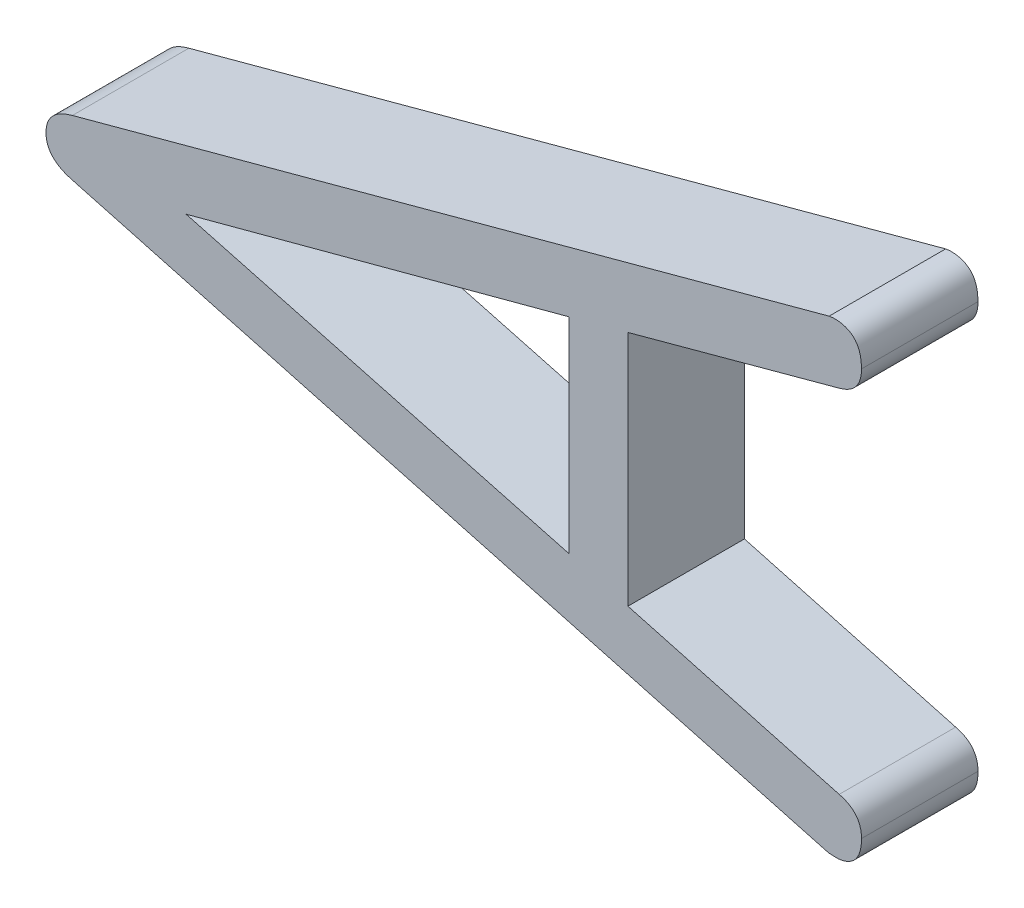
ISO-10303-21;
HEADER;
FILE_DESCRIPTION(('STEP AP214'),'2;1');
FILE_NAME('part.step','',(''),(''),'','','');
FILE_SCHEMA(('AUTOMOTIVE_DESIGN { 1 0 10303 214 1 1 1 1 }'));
ENDSEC;
DATA;
#1=APPLICATION_CONTEXT('core data for automotive mechanical design processes');
#2=APPLICATION_PROTOCOL_DEFINITION('international standard','automotive_design',2000,#1);
#3=PRODUCT_CONTEXT('',#1,'mechanical');
#4=PRODUCT('Part','Part','',(#3));
#5=PRODUCT_RELATED_PRODUCT_CATEGORY('part','',(#4));
#6=PRODUCT_DEFINITION_FORMATION('','',#4);
#7=PRODUCT_DEFINITION_CONTEXT('part definition',#1,'design');
#8=PRODUCT_DEFINITION('design','',#6,#7);
#9=PRODUCT_DEFINITION_SHAPE('','',#8);
#10=(LENGTH_UNIT() NAMED_UNIT(*) SI_UNIT(.MILLI.,.METRE.));
#11=(NAMED_UNIT(*) PLANE_ANGLE_UNIT() SI_UNIT($,.RADIAN.));
#12=(NAMED_UNIT(*) SI_UNIT($,.STERADIAN.) SOLID_ANGLE_UNIT());
#13=UNCERTAINTY_MEASURE_WITH_UNIT(LENGTH_MEASURE(1.E-05),#10,'distance_accuracy_value','');
#14=(GEOMETRIC_REPRESENTATION_CONTEXT(3) GLOBAL_UNCERTAINTY_ASSIGNED_CONTEXT((#13)) GLOBAL_UNIT_ASSIGNED_CONTEXT((#10,
#11,#12)) REPRESENTATION_CONTEXT('',''));
#15=CARTESIAN_POINT('',(0.,0.,0.));
#16=DIRECTION('',(0.,0.,1.));
#17=DIRECTION('',(1.,0.,0.));
#18=AXIS2_PLACEMENT_3D('',#15,#16,#17);
#19=CARTESIAN_POINT('',(0.,0.,0.));
#20=DIRECTION('',(0.,0.,1.));
#21=DIRECTION('',(1.,0.,0.));
#22=AXIS2_PLACEMENT_3D('',#19,#20,#21);
#23=PLANE('',#22);
#24=CARTESIAN_POINT('',(0.,-20.965835,0.));
#25=CARTESIAN_POINT('',(-5.38407219336307E-07,-20.9641895282945,0.));
#26=CARTESIAN_POINT('',(-0.000117013442733891,-20.9625293910485,0.));
#27=CARTESIAN_POINT('',(-0.000658852744537271,-20.9592497195739,0.));
#28=CARTESIAN_POINT('',(-0.00108663645171929,-20.9576306067799,0.));
#29=CARTESIAN_POINT('',(-0.00253814219865416,-20.9540139914121,0.));
#30=CARTESIAN_POINT('',(-0.00371315197638576,-20.952070651746,0.));
#31=CARTESIAN_POINT('',(-0.00663820662719866,-20.9487216281334,0.));
#32=CARTESIAN_POINT('',(-0.00838746136126195,-20.9473152111211,0.));
#33=CARTESIAN_POINT('',(-0.0130400242117313,-20.9444794464118,0.));
#34=CARTESIAN_POINT('',(-0.0161141240982168,-20.9433069656226,0.));
#35=CARTESIAN_POINT('',(-0.0191450000000007,-20.94256,0.));
#36=B_SPLINE_CURVE_WITH_KNOTS('',3,(#24,#25,#26,#27,#28,#29,#30,#31,#32,#33,#34,#35),
.UNSPECIFIED.,.F.,.F.,(4,2,2,2,2,4),(0.,0.00495415730221606,0.00994723439248573,
0.0166074548038485,0.0232585491518781,0.0328068137249233),.UNSPECIFIED.);
#37=CARTESIAN_POINT('',(0.,-20.965835,0.));
#38=VERTEX_POINT('',#37);
#39=CARTESIAN_POINT('',(-0.0191450000000007,-20.94256,0.));
#40=VERTEX_POINT('',#39);
#41=EDGE_CURVE('E160',#38,#40,#36,.T.);
#42=ORIENTED_EDGE('',*,*,#41,.T.);
#43=DIRECTION('',(-0.965094055327873,0.261903540202878,0.));
#44=VECTOR('',#43,1.);
#45=CARTESIAN_POINT('',(-0.0191450000000007,-20.94256,0.));
#46=LINE('',#45,#44);
#47=CARTESIAN_POINT('',(-0.200479999999999,-20.89335,0.));
#48=VERTEX_POINT('',#47);
#49=EDGE_CURVE('E158',#48,#40,#46,.F.);
#50=ORIENTED_EDGE('',*,*,#49,.F.);
#51=DIRECTION('',(0.,1.,0.));
#52=VECTOR('',#51,1.);
#53=CARTESIAN_POINT('',(-0.20048,-20.89335,0.));
#54=LINE('',#53,#52);
#55=CARTESIAN_POINT('',(-0.20048,-20.6898425,0.));
#56=VERTEX_POINT('',#55);
#57=EDGE_CURVE('E153',#56,#48,#54,.F.);
#58=ORIENTED_EDGE('',*,*,#57,.F.);
#59=DIRECTION('',(0.965091347312727,0.261913518822732,0.));
#60=VECTOR('',#59,1.);
#61=CARTESIAN_POINT('',(-0.20048,-20.6898425,0.));
#62=LINE('',#61,#60);
#63=CARTESIAN_POINT('',(-0.0188300000000006,-20.640545,0.));
#64=VERTEX_POINT('',#63);
#65=EDGE_CURVE('E107',#64,#56,#62,.F.);
#66=ORIENTED_EDGE('',*,*,#65,.F.);
#67=CARTESIAN_POINT('',(-0.0188300000000007,-20.640545,0.));
#68=CARTESIAN_POINT('',(-0.0172291255456361,-20.6401102023871,0.));
#69=CARTESIAN_POINT('',(-0.0156423397315893,-20.6395828181011,0.));
#70=CARTESIAN_POINT('',(-0.0125509346733398,-20.6382749524244,0.));
#71=CARTESIAN_POINT('',(-0.0110479156612131,-20.6374907736855,0.));
#72=CARTESIAN_POINT('',(-0.00769873391991095,-20.6352556588577,0.));
#73=CARTESIAN_POINT('',(-0.00593758234785945,-20.6336647386183,0.));
#74=CARTESIAN_POINT('',(-0.00309598229457966,-20.6299511927499,0.));
#75=CARTESIAN_POINT('',(-0.00201715360182063,-20.6278273184789,0.));
#76=CARTESIAN_POINT('',(-0.000820568978982714,-20.6241662108066,0.));
#77=CARTESIAN_POINT('',(-0.000497990746064361,-20.6226865258939,0.));
#78=CARTESIAN_POINT('',(-9.02200627983599E-05,-20.6197110961901,0.));
#79=CARTESIAN_POINT('',(-2.24590766741666E-06,-20.6182157526068,0.));
#80=CARTESIAN_POINT('',(0.,-20.6167275,0.));
#81=B_SPLINE_CURVE_WITH_KNOTS('',3,(#67,#68,#69,#70,#71,#72,#73,#74,#75,#76,#77,#78,#79,#80),
.UNSPECIFIED.,.F.,.F.,(4,2,2,2,2,2,4),(0.,0.00498912468275055,0.0100534974503611,
0.0170319611891002,0.0240269297556168,0.0285528363750397,0.0330248355606731),.UNSPECIFIED.);
#82=CARTESIAN_POINT('',(0.,-20.6167275,0.));
#83=VERTEX_POINT('',#82);
#84=EDGE_CURVE('E24',#64,#83,#81,.T.);
#85=ORIENTED_EDGE('',*,*,#84,.T.);
#86=CARTESIAN_POINT('',(0.,-20.6167275,0.));
#87=CARTESIAN_POINT('',(-1.90610001418E-06,-20.6129984591165,0.));
#88=CARTESIAN_POINT('',(-0.000380273966235727,-20.6089537142685,0.));
#89=CARTESIAN_POINT('',(-0.00224297751805529,-20.6030798374605,0.));
#90=CARTESIAN_POINT('',(-0.00318841572751478,-20.6010400965005,0.));
#91=CARTESIAN_POINT('',(-0.00578269702755131,-20.5973939433206,0.));
#92=CARTESIAN_POINT('',(-0.00743670465984391,-20.5957908569051,0.));
#93=CARTESIAN_POINT('',(-0.0109951144411367,-20.5934603507534,0.));
#94=CARTESIAN_POINT('',(-0.0128524949895165,-20.5926564630641,0.));
#95=CARTESIAN_POINT('',(-0.0163979853077391,-20.591600823073,0.));
#96=CARTESIAN_POINT('',(-0.0180687822878868,-20.5912836190185,0.));
#97=CARTESIAN_POINT('',(-0.0214428190107294,-20.5909258297718,0.));
#98=CARTESIAN_POINT('',(-0.0231461841814128,-20.5908867274637,0.));
#99=CARTESIAN_POINT('',(-0.0258273333010749,-20.5908761336677,0.));
#100=CARTESIAN_POINT('',(-0.026805608433475,-20.5908829604279,0.));
#101=CARTESIAN_POINT('',(-0.027781250000001,-20.59088,0.));
#102=B_SPLINE_CURVE_WITH_KNOTS('',3,(#86,#87,#88,#89,#90,#91,#92,#93,#94,#95,#96,#97,#98,#99,
#100,#101),.UNSPECIFIED.,.F.,.F.,(4,2,2,2,2,2,2,4),(0.,0.0116098131736958,0.0182812397968985,
0.0250021425660858,0.0309896165229199,0.0360650434445745,0.0411675132253157,0.0440999473004305),.UNSPECIFIED.);
#103=CARTESIAN_POINT('',(-0.027781250000001,-20.5913875,0.));
#104=VERTEX_POINT('',#103);
#105=EDGE_CURVE('E172',#83,#104,#102,.T.);
#106=ORIENTED_EDGE('',*,*,#105,.T.);
#107=DIRECTION('',(-0.965159249081074,-0.261663187921531,0.));
#108=VECTOR('',#107,1.);
#109=CARTESIAN_POINT('',(-0.0315350000000007,-20.591895,0.));
#110=LINE('',#109,#108);
#111=CARTESIAN_POINT('',(-0.677355,-20.7669825,0.));
#112=VERTEX_POINT('',#111);
#113=EDGE_CURVE('E169',#112,#104,#110,.F.);
#114=ORIENTED_EDGE('',*,*,#113,.F.);
#115=CARTESIAN_POINT('',(-0.677355,-20.7669825,0.));
#116=CARTESIAN_POINT('',(-0.681445124567429,-20.7680386258529,0.));
#117=CARTESIAN_POINT('',(-0.685761636813683,-20.7696443923188,0.));
#118=CARTESIAN_POINT('',(-0.691634911975885,-20.7734001191879,0.));
#119=CARTESIAN_POINT('',(-0.693581433872593,-20.7750215862819,0.));
#120=CARTESIAN_POINT('',(-0.696000889106864,-20.7779130004079,0.));
#121=CARTESIAN_POINT('',(-0.696726282729974,-20.778959595925,0.));
#122=CARTESIAN_POINT('',(-0.697963923417369,-20.7811770382733,0.));
#123=CARTESIAN_POINT('',(-0.698475244375721,-20.7823483980175,0.));
#124=CARTESIAN_POINT('',(-0.699267929924678,-20.7847539470738,0.));
#125=CARTESIAN_POINT('',(-0.699551123355671,-20.7859875507089,0.));
#126=CARTESIAN_POINT('',(-0.69991796378007,-20.7884801920008,0.));
#127=CARTESIAN_POINT('',(-0.700002345599501,-20.7897391185971,0.));
#128=CARTESIAN_POINT('',(-0.7,-20.7909925,0.));
#129=B_SPLINE_CURVE_WITH_KNOTS('',3,(#115,#116,#117,#118,#119,#120,#121,#122,#123,#124,#125,
#126,#127,#128),.UNSPECIFIED.,.F.,.F.,(4,2,2,2,2,2,4),(0.,0.0131535275612907,0.0206675648823954,
0.0244618302820655,0.0282723446616511,0.0320519983169981,0.0358176599582393),.UNSPECIFIED.);
#130=CARTESIAN_POINT('',(-0.7,-20.7909925,0.));
#131=VERTEX_POINT('',#130);
#132=EDGE_CURVE('E278',#112,#131,#129,.T.);
#133=ORIENTED_EDGE('',*,*,#132,.T.);
#134=CARTESIAN_POINT('',(-0.7,-20.7909925,0.));
#135=CARTESIAN_POINT('',(-0.69999892038872,-20.7922635879036,0.));
#136=CARTESIAN_POINT('',(-0.699914466904244,-20.7935388921848,0.));
#137=CARTESIAN_POINT('',(-0.699542931868941,-20.7960624317335,0.));
#138=CARTESIAN_POINT('',(-0.699255243044904,-20.7973105742905,0.));
#139=CARTESIAN_POINT('',(-0.698031930811526,-20.8009545128084,0.));
#140=CARTESIAN_POINT('',(-0.696735737426904,-20.8032436568055,0.));
#141=CARTESIAN_POINT('',(-0.69361975494692,-20.8069307557754,0.));
#142=CARTESIAN_POINT('',(-0.691881783059184,-20.8084028205992,0.));
#143=CARTESIAN_POINT('',(-0.686628214932906,-20.811913414663,0.));
#144=CARTESIAN_POINT('',(-0.682802947352197,-20.8134627690514,0.));
#145=CARTESIAN_POINT('',(-0.67843301652798,-20.8147414809587,0.));
#146=CARTESIAN_POINT('',(-0.677955420058924,-20.8148747900977,0.));
#147=CARTESIAN_POINT('',(-0.6774775,-20.8150025,0.));
#148=B_SPLINE_CURVE_WITH_KNOTS('',3,(#134,#135,#136,#137,#138,#139,#140,#141,#142,#143,#144,
#145,#146,#147),.UNSPECIFIED.,.F.,.F.,(4,2,2,2,2,2,4),(0.,0.00381590843167996,
0.00764326740341676,0.0153154017907293,0.0220639355261604,0.0342121446034566,
0.0356991780130972),.UNSPECIFIED.);
#149=CARTESIAN_POINT('',(-0.6774775,-20.8150025,0.));
#150=VERTEX_POINT('',#149);
#151=EDGE_CURVE('E166',#131,#150,#148,.T.);
#152=ORIENTED_EDGE('',*,*,#151,.T.);
#153=DIRECTION('',(0.965108391126506,-0.261850708185422,0.));
#154=VECTOR('',#153,1.);
#155=CARTESIAN_POINT('',(-0.6774775,-20.8150025,0.));
#156=LINE('',#155,#154);
#157=CARTESIAN_POINT('',(-0.0282100000000009,-20.990615,0.));
#158=VERTEX_POINT('',#157);
#159=EDGE_CURVE('E163',#158,#150,#156,.F.);
#160=ORIENTED_EDGE('',*,*,#159,.F.);
#161=CARTESIAN_POINT('',(-0.0282100000000009,-20.991105,0.));
#162=CARTESIAN_POINT('',(-0.0271888055190586,-20.9910944527848,0.));
#163=CARTESIAN_POINT('',(-0.0261667969211133,-20.9911047087477,0.));
#164=CARTESIAN_POINT('',(-0.0241187745566307,-20.9911052924491,0.));
#165=CARTESIAN_POINT('',(-0.0230927615886677,-20.9910955381279,0.));
#166=CARTESIAN_POINT('',(-0.0199726932722785,-20.9909404473551,0.));
#167=CARTESIAN_POINT('',(-0.0178818798184939,-20.9906641958529,0.));
#168=CARTESIAN_POINT('',(-0.0136787315281961,-20.9896098026289,0.));
#169=CARTESIAN_POINT('',(-0.0115724193006684,-20.9888029813402,0.));
#170=CARTESIAN_POINT('',(-0.00775444463106447,-20.9864649740314,0.));
#171=CARTESIAN_POINT('',(-0.00604589492170586,-20.9849283432392,0.));
#172=CARTESIAN_POINT('',(-0.00348038341389043,-20.9815386422973,0.));
#173=CARTESIAN_POINT('',(-0.00255168166255532,-20.979737265224,0.));
#174=CARTESIAN_POINT('',(-0.000704404057614361,-20.9747333505688,0.));
#175=CARTESIAN_POINT('',(-0.00019887998763729,-20.971392172241,0.));
#176=CARTESIAN_POINT('',(-1.63718856808725E-05,-20.9673212824857,0.));
#177=CARTESIAN_POINT('',(-8.65963129606131E-07,-20.9665764246867,0.));
#178=CARTESIAN_POINT('',(0.,-20.965835,0.));
#179=B_SPLINE_CURVE_WITH_KNOTS('',3,(#161,#162,#163,#164,#165,#166,#167,#168,#169,#170,#171,
#172,#173,#174,#175,#176,#177,#178),.UNSPECIFIED.,.F.,.F.,(4,2,2,2,2,2,2,2,4),(0.,
0.00306511470410455,0.00614282420202275,0.0124336328196739,0.019095996956005,0.0258088659704043,
0.0318009512289116,0.0417566562582806,0.043989154051127),.UNSPECIFIED.);
#180=EDGE_CURVE('E331',#158,#38,#179,.T.);
#181=ORIENTED_EDGE('',*,*,#180,.T.);
#182=EDGE_LOOP('',(#42,#50,#58,#66,#85,#106,#114,#133,#152,#160,#181));
#183=FACE_BOUND('',#182,.T.);
#184=DIRECTION('',(0.965955392140959,-0.258708678620966,0.));
#185=VECTOR('',#184,1.);
#186=CARTESIAN_POINT('',(-0.25088,-20.8796475,0.));
#187=LINE('',#186,#185);
#188=CARTESIAN_POINT('',(-0.25088,-20.8796475,0.));
#189=VERTEX_POINT('',#188);
#190=CARTESIAN_POINT('',(-0.579740000000001,-20.79157,0.));
#191=VERTEX_POINT('',#190);
#192=EDGE_CURVE('E124',#189,#191,#187,.F.);
#193=ORIENTED_EDGE('',*,*,#192,.T.);
#194=DIRECTION('',(-0.965955392140954,-0.258708678620985,0.));
#195=VECTOR('',#194,1.);
#196=CARTESIAN_POINT('',(-0.57974,-20.79157,0.));
#197=LINE('',#196,#195);
#198=CARTESIAN_POINT('',(-0.25088,-20.7034925,0.));
#199=VERTEX_POINT('',#198);
#200=EDGE_CURVE('E116',#191,#199,#197,.F.);
#201=ORIENTED_EDGE('',*,*,#200,.T.);
#202=DIRECTION('',(0.,1.,0.));
#203=VECTOR('',#202,1.);
#204=CARTESIAN_POINT('',(-0.25088,-20.7034925,0.));
#205=LINE('',#204,#203);
#206=EDGE_CURVE('E125',#199,#189,#205,.F.);
#207=ORIENTED_EDGE('',*,*,#206,.T.);
#208=EDGE_LOOP('',(#193,#201,#207));
#209=FACE_BOUND('',#208,.T.);
#210=ADVANCED_FACE('F17',(#183,#209),#23,.T.);
#211=CARTESIAN_POINT('',(-0.25088,-20.8796475,-0.1));
#212=DIRECTION('',(-0.258708678620966,-0.965955392140959,0.));
#213=DIRECTION('',(0.965955392140959,-0.258708678620966,0.));
#214=AXIS2_PLACEMENT_3D('',#211,#212,#213);
#215=PLANE('',#214);
#216=DIRECTION('',(0.,0.,-1.));
#217=VECTOR('',#216,1.);
#218=CARTESIAN_POINT('',(-0.25088,-20.8796475,-0.1));
#219=LINE('',#218,#217);
#220=CARTESIAN_POINT('',(-0.25088,-20.8796475,-0.1));
#221=VERTEX_POINT('',#220);
#222=EDGE_CURVE('E140',#189,#221,#219,.T.);
#223=ORIENTED_EDGE('',*,*,#222,.T.);
#224=DIRECTION('',(-0.965955392140954,0.258708678620984,0.));
#225=VECTOR('',#224,1.);
#226=CARTESIAN_POINT('',(-0.25088,-20.8796475,-0.1));
#227=LINE('',#226,#225);
#228=CARTESIAN_POINT('',(-0.579740000000001,-20.79157,-0.1));
#229=VERTEX_POINT('',#228);
#230=EDGE_CURVE('E145',#221,#229,#227,.T.);
#231=ORIENTED_EDGE('',*,*,#230,.T.);
#232=DIRECTION('',(0.,0.,1.));
#233=VECTOR('',#232,1.);
#234=CARTESIAN_POINT('',(-0.57974,-20.79157,-0.1));
#235=LINE('',#234,#233);
#236=EDGE_CURVE('E130',#229,#191,#235,.T.);
#237=ORIENTED_EDGE('',*,*,#236,.T.);
#238=ORIENTED_EDGE('',*,*,#192,.F.);
#239=EDGE_LOOP('',(#223,#231,#237,#238));
#240=FACE_BOUND('',#239,.T.);
#241=ADVANCED_FACE('F143',(#240),#215,.F.);
#242=CARTESIAN_POINT('',(-0.57974,-20.79157,-0.1));
#243=DIRECTION('',(-0.258708678620985,0.965955392140954,0.));
#244=DIRECTION('',(-0.965955392140954,-0.258708678620985,0.));
#245=AXIS2_PLACEMENT_3D('',#242,#243,#244);
#246=PLANE('',#245);
#247=ORIENTED_EDGE('',*,*,#236,.F.);
#248=DIRECTION('',(0.965955392140957,0.258708678620975,0.));
#249=VECTOR('',#248,1.);
#250=CARTESIAN_POINT('',(-0.57974,-20.79157,-0.1));
#251=LINE('',#250,#249);
#252=CARTESIAN_POINT('',(-0.25088,-20.7034925,-0.1));
#253=VERTEX_POINT('',#252);
#254=EDGE_CURVE('E314',#229,#253,#251,.T.);
#255=ORIENTED_EDGE('',*,*,#254,.T.);
#256=DIRECTION('',(0.,0.,-1.));
#257=VECTOR('',#256,1.);
#258=CARTESIAN_POINT('',(-0.25088,-20.7034925,-0.1));
#259=LINE('',#258,#257);
#260=EDGE_CURVE('E139',#253,#199,#259,.F.);
#261=ORIENTED_EDGE('',*,*,#260,.T.);
#262=ORIENTED_EDGE('',*,*,#200,.F.);
#263=EDGE_LOOP('',(#247,#255,#261,#262));
#264=FACE_BOUND('',#263,.T.);
#265=ADVANCED_FACE('F135',(#264),#246,.F.);
#266=CARTESIAN_POINT('',(-0.25088,-20.7034925,-0.1));
#267=DIRECTION('',(1.,0.,0.));
#268=DIRECTION('',(0.,0.,-1.));
#269=AXIS2_PLACEMENT_3D('',#266,#267,#268);
#270=PLANE('',#269);
#271=ORIENTED_EDGE('',*,*,#260,.F.);
#272=DIRECTION('',(0.,1.,0.));
#273=VECTOR('',#272,1.);
#274=CARTESIAN_POINT('',(-0.25088,0.,-0.1));
#275=LINE('',#274,#273);
#276=EDGE_CURVE('E309',#253,#221,#275,.F.);
#277=ORIENTED_EDGE('',*,*,#276,.T.);
#278=ORIENTED_EDGE('',*,*,#222,.F.);
#279=ORIENTED_EDGE('',*,*,#206,.F.);
#280=EDGE_LOOP('',(#271,#277,#278,#279));
#281=FACE_BOUND('',#280,.T.);
#282=ADVANCED_FACE('F310',(#281),#270,.F.);
#283=CARTESIAN_POINT('',(-0.20048,-20.6898425,-0.1));
#284=DIRECTION('',(0.261913518822732,-0.965091347312727,0.));
#285=DIRECTION('',(0.965091347312727,0.261913518822732,0.));
#286=AXIS2_PLACEMENT_3D('',#283,#284,#285);
#287=PLANE('',#286);
#288=DIRECTION('',(0.965091347312727,0.261913518822732,0.));
#289=VECTOR('',#288,1.);
#290=CARTESIAN_POINT('',(-0.20048,-20.6898425,-0.1));
#291=LINE('',#290,#289);
#292=CARTESIAN_POINT('',(-0.20048,-20.6898425,-0.1));
#293=VERTEX_POINT('',#292);
#294=CARTESIAN_POINT('',(-0.0188300000000007,-20.640545,-0.1));
#295=VERTEX_POINT('',#294);
#296=EDGE_CURVE('E313',#293,#295,#291,.T.);
#297=ORIENTED_EDGE('',*,*,#296,.T.);
#298=DIRECTION('',(0.,0.,1.));
#299=VECTOR('',#298,1.);
#300=CARTESIAN_POINT('',(-0.0188300000000007,-20.640545,-0.05));
#301=LINE('',#300,#299);
#302=EDGE_CURVE('E150',#295,#64,#301,.T.);
#303=ORIENTED_EDGE('',*,*,#302,.T.);
#304=ORIENTED_EDGE('',*,*,#65,.T.);
#305=DIRECTION('',(0.,0.,-1.));
#306=VECTOR('',#305,1.);
#307=CARTESIAN_POINT('',(-0.20048,-20.6898425,-0.1));
#308=LINE('',#307,#306);
#309=EDGE_CURVE('E300',#293,#56,#308,.F.);
#310=ORIENTED_EDGE('',*,*,#309,.F.);
#311=EDGE_LOOP('',(#297,#303,#304,#310));
#312=FACE_BOUND('',#311,.T.);
#313=ADVANCED_FACE('F373',(#312),#287,.T.);
#314=CARTESIAN_POINT('',(-0.0188300000000007,-20.640545,-0.1));
#315=CARTESIAN_POINT('',(0.,-20.63547,-0.1));
#316=CARTESIAN_POINT('',(0.,-20.6167275,-0.1));
#317=CARTESIAN_POINT('',(-0.0188300000000007,-20.640545,0.));
#318=CARTESIAN_POINT('',(0.,-20.63547,0.));
#319=CARTESIAN_POINT('',(0.,-20.6167275,0.));
#320=B_SPLINE_SURFACE_WITH_KNOTS('',1,2,((#314,#315,#316),(#317,#318,#319)),.UNSPECIFIED.,.F.,
.F.,.F.,(2,2),(3,3),(0.,1.),(0.,1.),.UNSPECIFIED.);
#321=CARTESIAN_POINT('',(-0.0188300000000007,-20.640545,-0.1));
#322=CARTESIAN_POINT('',(-0.0172291255456366,-20.6401102023871,-0.1));
#323=CARTESIAN_POINT('',(-0.0156423397315896,-20.6395828181011,-0.1));
#324=CARTESIAN_POINT('',(-0.0125509346733393,-20.6382749524244,-0.1));
#325=CARTESIAN_POINT('',(-0.0110479156612119,-20.6374907736855,-0.1));
#326=CARTESIAN_POINT('',(-0.00769873391990959,-20.6352556588577,-0.1));
#327=CARTESIAN_POINT('',(-0.00593758234785881,-20.6336647386183,-0.1));
#328=CARTESIAN_POINT('',(-0.00309598229457904,-20.6299511927499,-0.1));
#329=CARTESIAN_POINT('',(-0.00201715360181941,-20.6278273184789,-0.1));
#330=CARTESIAN_POINT('',(-0.000820568978982389,-20.6241662108066,-0.1));
#331=CARTESIAN_POINT('',(-0.00049799074606476,-20.6226865258939,-0.1));
#332=CARTESIAN_POINT('',(-9.02200627992339E-05,-20.6197110961901,-0.1));
#333=CARTESIAN_POINT('',(-2.24590766824327E-06,-20.6182157526068,-0.1));
#334=CARTESIAN_POINT('',(0.,-20.6167275,-0.1));
#335=B_SPLINE_CURVE_WITH_KNOTS('',3,(#321,#322,#323,#324,#325,#326,#327,#328,#329,#330,#331,
#332,#333,#334),.UNSPECIFIED.,.F.,.F.,(4,2,2,2,2,2,4),(0.,0.00498912468275175,
0.0100534974503636,0.0170319611891019,0.0240269297556187,0.0285528363750379,0.0330248355606713),.UNSPECIFIED.);
#336=CARTESIAN_POINT('',(0.,-20.6167275,-0.1));
#337=VERTEX_POINT('',#336);
#338=EDGE_CURVE('E221',#295,#337,#335,.T.);
#339=DIRECTION('',(0.,0.,1.));
#340=VECTOR('',#339,1.);
#341=CARTESIAN_POINT('',(0.,-20.6167275,-0.05));
#342=LINE('',#341,#340);
#343=EDGE_CURVE('E295',#337,#83,#342,.T.);
#344=ORIENTED_EDGE('',*,*,#302,.F.);
#345=ORIENTED_EDGE('',*,*,#338,.T.);
#346=ORIENTED_EDGE('',*,*,#343,.T.);
#347=ORIENTED_EDGE('',*,*,#84,.F.);
#348=EDGE_LOOP('',(#344,#345,#346,#347));
#349=FACE_BOUND('',#348,.T.);
#350=ADVANCED_FACE('F232',(#349),#320,.F.);
#351=CARTESIAN_POINT('',(0.,-20.6167275,-0.1));
#352=CARTESIAN_POINT('',(0.,-20.59088,-0.1));
#353=CARTESIAN_POINT('',(-0.0240275000000007,-20.59088,-0.1));
#354=CARTESIAN_POINT('',(-0.0260598012500008,-20.59088,-0.1));
#355=CARTESIAN_POINT('',(-0.028092102500001,-20.59088,-0.1));
#356=CARTESIAN_POINT('',(0.,-20.6167275,0.));
#357=CARTESIAN_POINT('',(0.,-20.59088,0.));
#358=CARTESIAN_POINT('',(-0.0240275000000007,-20.59088,0.));
#359=CARTESIAN_POINT('',(-0.0260598012500008,-20.59088,0.));
#360=CARTESIAN_POINT('',(-0.028092102500001,-20.59088,0.));
#361=B_SPLINE_SURFACE_WITH_KNOTS('',1,2,((#351,#352,#353,#354,#355),(#356,#357,#358,#359,#360)),
.UNSPECIFIED.,.F.,.F.,.F.,(2,2),(3,2,3),(0.,1.),(0.,1.,1.0845823015295),.UNSPECIFIED.);
#362=CARTESIAN_POINT('',(0.,-20.6167275,-0.1));
#363=CARTESIAN_POINT('',(-1.90610001417829E-06,-20.6129984591165,-0.1));
#364=CARTESIAN_POINT('',(-0.000380273966235727,-20.6089537142685,-0.1));
#365=CARTESIAN_POINT('',(-0.00224297751805529,-20.6030798374605,-0.1));
#366=CARTESIAN_POINT('',(-0.00318841572751478,-20.6010400965005,-0.1));
#367=CARTESIAN_POINT('',(-0.00578269702755131,-20.5973939433206,-0.1));
#368=CARTESIAN_POINT('',(-0.00743670465984391,-20.5957908569051,-0.1));
#369=CARTESIAN_POINT('',(-0.0109951144411368,-20.5934603507534,-0.1));
#370=CARTESIAN_POINT('',(-0.0128524949895165,-20.5926564630641,-0.1));
#371=CARTESIAN_POINT('',(-0.0163979853077392,-20.591600823073,-0.1));
#372=CARTESIAN_POINT('',(-0.0180687822878871,-20.5912836190185,-0.1));
#373=CARTESIAN_POINT('',(-0.0214428190107301,-20.5909258297718,-0.1));
#374=CARTESIAN_POINT('',(-0.0231461841814136,-20.5908867274637,-0.1));
#375=CARTESIAN_POINT('',(-0.0258273333010756,-20.5908761336677,-0.1));
#376=CARTESIAN_POINT('',(-0.0268056084334754,-20.5908829604279,-0.1));
#377=CARTESIAN_POINT('',(-0.027781250000001,-20.59088,-0.1));
#378=B_SPLINE_CURVE_WITH_KNOTS('',3,(#362,#363,#364,#365,#366,#367,#368,#369,#370,#371,#372,
#373,#374,#375,#376,#377),.UNSPECIFIED.,.F.,.F.,(4,2,2,2,2,2,2,4),(0.,0.0116098131736958,
0.0182812397968985,0.0250021425660858,0.0309896165229199,0.036065043444575,0.0411675132253165,
0.0440999473004304),.UNSPECIFIED.);
#379=CARTESIAN_POINT('',(-0.027781250000001,-20.5913875,-0.1));
#380=VERTEX_POINT('',#379);
#381=EDGE_CURVE('E220',#337,#380,#378,.T.);
#382=DIRECTION('',(0.,0.,1.));
#383=VECTOR('',#382,1.);
#384=CARTESIAN_POINT('',(-0.0277911159420295,-20.59088,0.));
#385=LINE('',#384,#383);
#386=EDGE_CURVE('E171',#104,#380,#385,.F.);
#387=ORIENTED_EDGE('',*,*,#343,.F.);
#388=ORIENTED_EDGE('',*,*,#381,.T.);
#389=ORIENTED_EDGE('',*,*,#386,.F.);
#390=ORIENTED_EDGE('',*,*,#105,.F.);
#391=EDGE_LOOP('',(#387,#388,#389,#390));
#392=FACE_BOUND('',#391,.T.);
#393=ADVANCED_FACE('F226',(#392),#361,.F.);
#394=CARTESIAN_POINT('',(-0.0315350000000007,-20.591895,-0.1));
#395=DIRECTION('',(-0.261663187921531,0.965159249081074,0.));
#396=DIRECTION('',(-0.965159249081074,-0.261663187921531,0.));
#397=AXIS2_PLACEMENT_3D('',#394,#395,#396);
#398=PLANE('',#397);
#399=DIRECTION('',(-0.965159249081074,-0.261663187921531,0.));
#400=VECTOR('',#399,1.);
#401=CARTESIAN_POINT('',(-0.0315350000000007,-20.591895,-0.1));
#402=LINE('',#401,#400);
#403=CARTESIAN_POINT('',(-0.677355,-20.7669825,-0.1));
#404=VERTEX_POINT('',#403);
#405=EDGE_CURVE('E360',#380,#404,#402,.T.);
#406=ORIENTED_EDGE('',*,*,#405,.T.);
#407=DIRECTION('',(0.,0.,1.));
#408=VECTOR('',#407,1.);
#409=CARTESIAN_POINT('',(-0.677355,-20.7669825,-0.05));
#410=LINE('',#409,#408);
#411=EDGE_CURVE('E284',#404,#112,#410,.T.);
#412=ORIENTED_EDGE('',*,*,#411,.T.);
#413=ORIENTED_EDGE('',*,*,#113,.T.);
#414=ORIENTED_EDGE('',*,*,#386,.T.);
#415=EDGE_LOOP('',(#406,#412,#413,#414));
#416=FACE_BOUND('',#415,.T.);
#417=ADVANCED_FACE('F231',(#416),#398,.T.);
#418=CARTESIAN_POINT('',(-0.677355,-20.7669825,-0.1));
#419=CARTESIAN_POINT('',(-0.7,-20.772985,-0.1));
#420=CARTESIAN_POINT('',(-0.7,-20.7909925,-0.1));
#421=CARTESIAN_POINT('',(-0.677355,-20.7669825,0.));
#422=CARTESIAN_POINT('',(-0.7,-20.772985,0.));
#423=CARTESIAN_POINT('',(-0.7,-20.7909925,0.));
#424=B_SPLINE_SURFACE_WITH_KNOTS('',1,2,((#418,#419,#420),(#421,#422,#423)),.UNSPECIFIED.,.F.,
.F.,.F.,(2,2),(3,3),(0.,1.),(0.,1.),.UNSPECIFIED.);
#425=CARTESIAN_POINT('',(-0.677355,-20.7669825,-0.1));
#426=CARTESIAN_POINT('',(-0.68144512456743,-20.7680386258529,-0.1));
#427=CARTESIAN_POINT('',(-0.685761636813683,-20.7696443923188,-0.1));
#428=CARTESIAN_POINT('',(-0.691634911975884,-20.7734001191879,-0.1));
#429=CARTESIAN_POINT('',(-0.693581433872593,-20.7750215862819,-0.1));
#430=CARTESIAN_POINT('',(-0.696000889106864,-20.7779130004079,-0.1));
#431=CARTESIAN_POINT('',(-0.696726282729974,-20.778959595925,-0.1));
#432=CARTESIAN_POINT('',(-0.697963923417369,-20.7811770382733,-0.1));
#433=CARTESIAN_POINT('',(-0.698475244375721,-20.7823483980175,-0.1));
#434=CARTESIAN_POINT('',(-0.699267929924678,-20.7847539470738,-0.1));
#435=CARTESIAN_POINT('',(-0.699551123355671,-20.7859875507089,-0.1));
#436=CARTESIAN_POINT('',(-0.699917963780071,-20.7884801920008,-0.1));
#437=CARTESIAN_POINT('',(-0.700002345599502,-20.7897391185971,-0.1));
#438=CARTESIAN_POINT('',(-0.7,-20.7909925,-0.1));
#439=B_SPLINE_CURVE_WITH_KNOTS('',3,(#425,#426,#427,#428,#429,#430,#431,#432,#433,#434,#435,
#436,#437,#438),.UNSPECIFIED.,.F.,.F.,(4,2,2,2,2,2,4),(0.,0.0131535275612907,0.0206675648823954,
0.0244618302820656,0.0282723446616511,0.0320519983169983,0.0358176599582394),.UNSPECIFIED.);
#440=CARTESIAN_POINT('',(-0.7,-20.7909925,-0.1));
#441=VERTEX_POINT('',#440);
#442=EDGE_CURVE('E208',#404,#441,#439,.T.);
#443=DIRECTION('',(0.,0.,1.));
#444=VECTOR('',#443,1.);
#445=CARTESIAN_POINT('',(-0.7,-20.7909925,-0.05));
#446=LINE('',#445,#444);
#447=EDGE_CURVE('E283',#441,#131,#446,.T.);
#448=ORIENTED_EDGE('',*,*,#411,.F.);
#449=ORIENTED_EDGE('',*,*,#442,.T.);
#450=ORIENTED_EDGE('',*,*,#447,.T.);
#451=ORIENTED_EDGE('',*,*,#132,.F.);
#452=EDGE_LOOP('',(#448,#449,#450,#451));
#453=FACE_BOUND('',#452,.T.);
#454=ADVANCED_FACE('F237',(#453),#424,.F.);
#455=CARTESIAN_POINT('',(-0.7,-20.7909925,-0.1));
#456=CARTESIAN_POINT('',(-0.7,-20.809,-0.1));
#457=CARTESIAN_POINT('',(-0.6774775,-20.8150025,-0.1));
#458=CARTESIAN_POINT('',(-0.7,-20.7909925,0.));
#459=CARTESIAN_POINT('',(-0.7,-20.809,0.));
#460=CARTESIAN_POINT('',(-0.6774775,-20.8150025,0.));
#461=B_SPLINE_SURFACE_WITH_KNOTS('',1,2,((#455,#456,#457),(#458,#459,#460)),.UNSPECIFIED.,.F.,
.F.,.F.,(2,2),(3,3),(0.,1.),(0.,1.),.UNSPECIFIED.);
#462=CARTESIAN_POINT('',(-0.7,-20.7909925,-0.1));
#463=CARTESIAN_POINT('',(-0.69999892038872,-20.7922635879036,-0.1));
#464=CARTESIAN_POINT('',(-0.699914466904244,-20.7935388921848,-0.1));
#465=CARTESIAN_POINT('',(-0.699542931868941,-20.7960624317335,-0.1));
#466=CARTESIAN_POINT('',(-0.699255243044904,-20.7973105742905,-0.1));
#467=CARTESIAN_POINT('',(-0.698031930811526,-20.8009545128084,-0.1));
#468=CARTESIAN_POINT('',(-0.696735737426904,-20.8032436568055,-0.1));
#469=CARTESIAN_POINT('',(-0.69361975494692,-20.8069307557754,-0.1));
#470=CARTESIAN_POINT('',(-0.691881783059184,-20.8084028205992,-0.1));
#471=CARTESIAN_POINT('',(-0.686628214932906,-20.811913414663,-0.1));
#472=CARTESIAN_POINT('',(-0.682802947352197,-20.8134627690514,-0.1));
#473=CARTESIAN_POINT('',(-0.67843301652798,-20.8147414809587,-0.1));
#474=CARTESIAN_POINT('',(-0.677955420058924,-20.8148747900977,-0.1));
#475=CARTESIAN_POINT('',(-0.6774775,-20.8150025,-0.1));
#476=B_SPLINE_CURVE_WITH_KNOTS('',3,(#462,#463,#464,#465,#466,#467,#468,#469,#470,#471,#472,
#473,#474,#475),.UNSPECIFIED.,.F.,.F.,(4,2,2,2,2,2,4),(0.,0.00381590843167996,
0.00764326740341676,0.0153154017907293,0.0220639355261604,0.0342121446034566,
0.0356991780130972),.UNSPECIFIED.);
#477=CARTESIAN_POINT('',(-0.6774775,-20.8150025,-0.1));
#478=VERTEX_POINT('',#477);
#479=EDGE_CURVE('E202',#441,#478,#476,.T.);
#480=DIRECTION('',(0.,0.,1.));
#481=VECTOR('',#480,1.);
#482=CARTESIAN_POINT('',(-0.6774775,-20.8150025,-0.1));
#483=LINE('',#482,#481);
#484=EDGE_CURVE('E165',#150,#478,#483,.F.);
#485=ORIENTED_EDGE('',*,*,#447,.F.);
#486=ORIENTED_EDGE('',*,*,#479,.T.);
#487=ORIENTED_EDGE('',*,*,#484,.F.);
#488=ORIENTED_EDGE('',*,*,#151,.F.);
#489=EDGE_LOOP('',(#485,#486,#487,#488));
#490=FACE_BOUND('',#489,.T.);
#491=ADVANCED_FACE('F387',(#490),#461,.F.);
#492=CARTESIAN_POINT('',(-0.6774775,-20.8150025,-0.1));
#493=DIRECTION('',(-0.261850708185422,-0.965108391126506,0.));
#494=DIRECTION('',(0.965108391126506,-0.261850708185422,0.));
#495=AXIS2_PLACEMENT_3D('',#492,#493,#494);
#496=PLANE('',#495);
#497=DIRECTION('',(0.965108391126506,-0.261850708185422,0.));
#498=VECTOR('',#497,1.);
#499=CARTESIAN_POINT('',(-0.6774775,-20.8150025,-0.1));
#500=LINE('',#499,#498);
#501=CARTESIAN_POINT('',(-0.0282100000000005,-20.990615,-0.1));
#502=VERTEX_POINT('',#501);
#503=EDGE_CURVE('E351',#478,#502,#500,.T.);
#504=ORIENTED_EDGE('',*,*,#503,.T.);
#505=DIRECTION('',(0.,0.,1.));
#506=VECTOR('',#505,1.);
#507=CARTESIAN_POINT('',(-0.0284129944039132,-20.991105,-0.1));
#508=LINE('',#507,#506);
#509=EDGE_CURVE('E332',#502,#158,#508,.T.);
#510=ORIENTED_EDGE('',*,*,#509,.T.);
#511=ORIENTED_EDGE('',*,*,#159,.T.);
#512=ORIENTED_EDGE('',*,*,#484,.T.);
#513=EDGE_LOOP('',(#504,#510,#511,#512));
#514=FACE_BOUND('',#513,.T.);
#515=ADVANCED_FACE('F384',(#514),#496,.T.);
#516=CARTESIAN_POINT('',(-0.0285256300000005,-20.991105,-0.1));
#517=CARTESIAN_POINT('',(-0.0264603150000006,-20.991105,-0.1));
#518=CARTESIAN_POINT('',(-0.0243950000000007,-20.991105,-0.1));
#519=CARTESIAN_POINT('',(0.,-20.991105,-0.1));
#520=CARTESIAN_POINT('',(0.,-20.965835,-0.1));
#521=CARTESIAN_POINT('',(-0.0285256300000005,-20.991105,0.));
#522=CARTESIAN_POINT('',(-0.0264603150000006,-20.991105,0.));
#523=CARTESIAN_POINT('',(-0.0243950000000007,-20.991105,0.));
#524=CARTESIAN_POINT('',(0.,-20.991105,0.));
#525=CARTESIAN_POINT('',(0.,-20.965835,0.));
#526=B_SPLINE_SURFACE_WITH_KNOTS('',1,2,((#516,#517,#518,#519,#520),(#521,#522,#523,#524,#525)),
.UNSPECIFIED.,.F.,.F.,.F.,(2,2),(3,2,3),(0.,1.),(-0.0846614060258185,0.,1.),.UNSPECIFIED.);
#527=CARTESIAN_POINT('',(-0.0282100000000005,-20.991105,-0.1));
#528=CARTESIAN_POINT('',(-0.0271888055190558,-20.9910944527848,-0.1));
#529=CARTESIAN_POINT('',(-0.026166796921108,-20.9911047087477,-0.1));
#530=CARTESIAN_POINT('',(-0.0241187745566206,-20.9911052924491,-0.1));
#531=CARTESIAN_POINT('',(-0.0230927615886552,-20.9910955381279,-0.1));
#532=CARTESIAN_POINT('',(-0.0199726932722589,-20.9909404473551,-0.1));
#533=CARTESIAN_POINT('',(-0.01788187981847,-20.9906641958529,-0.1));
#534=CARTESIAN_POINT('',(-0.0136787315281714,-20.9896098026289,-0.1));
#535=CARTESIAN_POINT('',(-0.011572419300647,-20.9888029813402,-0.1));
#536=CARTESIAN_POINT('',(-0.00775444463104937,-20.9864649740313,-0.1));
#537=CARTESIAN_POINT('',(-0.00604589492169385,-20.9849283432392,-0.1));
#538=CARTESIAN_POINT('',(-0.00348038341388322,-20.9815386422973,-0.1));
#539=CARTESIAN_POINT('',(-0.00255168166254993,-20.979737265224,-0.1));
#540=CARTESIAN_POINT('',(-0.000704404057611279,-20.9747333505688,-0.1));
#541=CARTESIAN_POINT('',(-0.000198879987635527,-20.971392172241,-0.1));
#542=CARTESIAN_POINT('',(-1.63718856806377E-05,-20.9673212824857,-0.1));
#543=CARTESIAN_POINT('',(-8.65963129583207E-07,-20.9665764246867,-0.1));
#544=CARTESIAN_POINT('',(0.,-20.965835,-0.1));
#545=B_SPLINE_CURVE_WITH_KNOTS('',3,(#527,#528,#529,#530,#531,#532,#533,#534,#535,#536,#537,
#538,#539,#540,#541,#542,#543,#544),.UNSPECIFIED.,.F.,.F.,(4,2,2,2,2,2,2,2,4),(0.,
0.00306511470411183,0.00614282420203704,0.0124336328197027,0.0190959969560259,
0.0258088659704188,0.0318009512289205,0.0417566562582923,0.0439891540511248),.UNSPECIFIED.);
#546=CARTESIAN_POINT('',(0.,-20.965835,-0.1));
#547=VERTEX_POINT('',#546);
#548=EDGE_CURVE('E182',#502,#547,#545,.T.);
#549=DIRECTION('',(0.,0.,1.));
#550=VECTOR('',#549,1.);
#551=CARTESIAN_POINT('',(0.,-20.965835,-0.05));
#552=LINE('',#551,#550);
#553=EDGE_CURVE('E329',#547,#38,#552,.T.);
#554=ORIENTED_EDGE('',*,*,#509,.F.);
#555=ORIENTED_EDGE('',*,*,#548,.T.);
#556=ORIENTED_EDGE('',*,*,#553,.T.);
#557=ORIENTED_EDGE('',*,*,#180,.F.);
#558=EDGE_LOOP('',(#554,#555,#556,#557));
#559=FACE_BOUND('',#558,.T.);
#560=ADVANCED_FACE('F349',(#559),#526,.F.);
#561=CARTESIAN_POINT('',(0.,-20.965835,-0.1));
#562=CARTESIAN_POINT('',(0.,-20.9475125,-0.1));
#563=CARTESIAN_POINT('',(-0.0191450000000007,-20.94256,-0.1));
#564=CARTESIAN_POINT('',(0.,-20.965835,0.));
#565=CARTESIAN_POINT('',(0.,-20.9475125,0.));
#566=CARTESIAN_POINT('',(-0.0191450000000007,-20.94256,0.));
#567=B_SPLINE_SURFACE_WITH_KNOTS('',1,2,((#561,#562,#563),(#564,#565,#566)),.UNSPECIFIED.,.F.,
.F.,.F.,(2,2),(3,3),(0.,1.),(0.,1.),.UNSPECIFIED.);
#568=CARTESIAN_POINT('',(0.,-20.965835,-0.1));
#569=CARTESIAN_POINT('',(-5.38407219336307E-07,-20.9641895282945,-0.1));
#570=CARTESIAN_POINT('',(-0.000117013442733891,-20.9625293910485,-0.1));
#571=CARTESIAN_POINT('',(-0.000658852744537271,-20.9592497195739,-0.1));
#572=CARTESIAN_POINT('',(-0.00108663645171929,-20.9576306067799,-0.1));
#573=CARTESIAN_POINT('',(-0.00253814219865416,-20.9540139914121,-0.1));
#574=CARTESIAN_POINT('',(-0.00371315197638576,-20.952070651746,-0.1));
#575=CARTESIAN_POINT('',(-0.00663820662719866,-20.9487216281334,-0.1));
#576=CARTESIAN_POINT('',(-0.00838746136126195,-20.9473152111211,-0.1));
#577=CARTESIAN_POINT('',(-0.0130400242117313,-20.9444794464118,-0.1));
#578=CARTESIAN_POINT('',(-0.0161141240982168,-20.9433069656226,-0.1));
#579=CARTESIAN_POINT('',(-0.0191450000000007,-20.94256,-0.1));
#580=B_SPLINE_CURVE_WITH_KNOTS('',3,(#568,#569,#570,#571,#572,#573,#574,#575,#576,#577,#578,
#579),.UNSPECIFIED.,.F.,.F.,(4,2,2,2,2,4),(0.,0.00495415730221606,0.00994723439248573,
0.0166074548038485,0.0232585491518781,0.0328068137249233),.UNSPECIFIED.);
#581=CARTESIAN_POINT('',(-0.0191450000000007,-20.94256,-0.1));
#582=VERTEX_POINT('',#581);
#583=EDGE_CURVE('E175',#547,#582,#580,.T.);
#584=DIRECTION('',(0.,0.,1.));
#585=VECTOR('',#584,1.);
#586=CARTESIAN_POINT('',(-0.0191450000000007,-20.94256,-0.1));
#587=LINE('',#586,#585);
#588=EDGE_CURVE('E155',#40,#582,#587,.F.);
#589=ORIENTED_EDGE('',*,*,#553,.F.);
#590=ORIENTED_EDGE('',*,*,#583,.T.);
#591=ORIENTED_EDGE('',*,*,#588,.F.);
#592=ORIENTED_EDGE('',*,*,#41,.F.);
#593=EDGE_LOOP('',(#589,#590,#591,#592));
#594=FACE_BOUND('',#593,.T.);
#595=ADVANCED_FACE('F19',(#594),#567,.F.);
#596=CARTESIAN_POINT('',(-0.0191450000000007,-20.94256,-0.1));
#597=DIRECTION('',(0.261903540202878,0.965094055327873,0.));
#598=DIRECTION('',(-0.965094055327873,0.261903540202878,0.));
#599=AXIS2_PLACEMENT_3D('',#596,#597,#598);
#600=PLANE('',#599);
#601=DIRECTION('',(-0.965094055327882,0.261903540202844,0.));
#602=VECTOR('',#601,1.);
#603=CARTESIAN_POINT('',(-0.0191450000000007,-20.94256,-0.1));
#604=LINE('',#603,#602);
#605=CARTESIAN_POINT('',(-0.20048,-20.89335,-0.1));
#606=VERTEX_POINT('',#605);
#607=EDGE_CURVE('E35',#582,#606,#604,.T.);
#608=ORIENTED_EDGE('',*,*,#607,.T.);
#609=DIRECTION('',(0.,0.,-1.));
#610=VECTOR('',#609,1.);
#611=CARTESIAN_POINT('',(-0.20048,-20.89335,-0.1));
#612=LINE('',#611,#610);
#613=EDGE_CURVE('E43',#48,#606,#612,.T.);
#614=ORIENTED_EDGE('',*,*,#613,.F.);
#615=ORIENTED_EDGE('',*,*,#49,.T.);
#616=ORIENTED_EDGE('',*,*,#588,.T.);
#617=EDGE_LOOP('',(#608,#614,#615,#616));
#618=FACE_BOUND('',#617,.T.);
#619=ADVANCED_FACE('F376',(#618),#600,.T.);
#620=CARTESIAN_POINT('',(-0.20048,-20.89335,-0.1));
#621=DIRECTION('',(1.,0.,0.));
#622=DIRECTION('',(0.,0.,-1.));
#623=AXIS2_PLACEMENT_3D('',#620,#621,#622);
#624=PLANE('',#623);
#625=DIRECTION('',(0.,1.,0.));
#626=VECTOR('',#625,1.);
#627=CARTESIAN_POINT('',(-0.20048,0.,-0.1));
#628=LINE('',#627,#626);
#629=EDGE_CURVE('E11',#606,#293,#628,.T.);
#630=ORIENTED_EDGE('',*,*,#629,.T.);
#631=ORIENTED_EDGE('',*,*,#309,.T.);
#632=ORIENTED_EDGE('',*,*,#57,.T.);
#633=ORIENTED_EDGE('',*,*,#613,.T.);
#634=EDGE_LOOP('',(#630,#631,#632,#633));
#635=FACE_BOUND('',#634,.T.);
#636=ADVANCED_FACE('F188',(#635),#624,.T.);
#637=CARTESIAN_POINT('',(0.,0.,-0.1));
#638=DIRECTION('',(0.,0.,1.));
#639=DIRECTION('',(1.,0.,0.));
#640=AXIS2_PLACEMENT_3D('',#637,#638,#639);
#641=PLANE('',#640);
#642=ORIENTED_EDGE('',*,*,#607,.F.);
#643=ORIENTED_EDGE('',*,*,#583,.F.);
#644=ORIENTED_EDGE('',*,*,#548,.F.);
#645=ORIENTED_EDGE('',*,*,#503,.F.);
#646=ORIENTED_EDGE('',*,*,#479,.F.);
#647=ORIENTED_EDGE('',*,*,#442,.F.);
#648=ORIENTED_EDGE('',*,*,#405,.F.);
#649=ORIENTED_EDGE('',*,*,#381,.F.);
#650=ORIENTED_EDGE('',*,*,#338,.F.);
#651=ORIENTED_EDGE('',*,*,#296,.F.);
#652=ORIENTED_EDGE('',*,*,#629,.F.);
#653=EDGE_LOOP('',(#642,#643,#644,#645,#646,#647,#648,#649,#650,#651,#652));
#654=FACE_BOUND('',#653,.T.);
#655=ORIENTED_EDGE('',*,*,#254,.F.);
#656=ORIENTED_EDGE('',*,*,#230,.F.);
#657=ORIENTED_EDGE('',*,*,#276,.F.);
#658=EDGE_LOOP('',(#655,#656,#657));
#659=FACE_BOUND('',#658,.T.);
#660=ADVANCED_FACE('F184',(#654,#659),#641,.F.);
#661=CLOSED_SHELL('',(#210,#241,#265,#282,#313,#350,#393,#417,#454,#491,#515,#560,#595,#619,
#636,#660));
#662=MANIFOLD_SOLID_BREP('B1',#661);
#663=ADVANCED_BREP_SHAPE_REPRESENTATION('',(#18,#662),#14);
#664=SHAPE_DEFINITION_REPRESENTATION(#9,#663);
ENDSEC;
END-ISO-10303-21;
